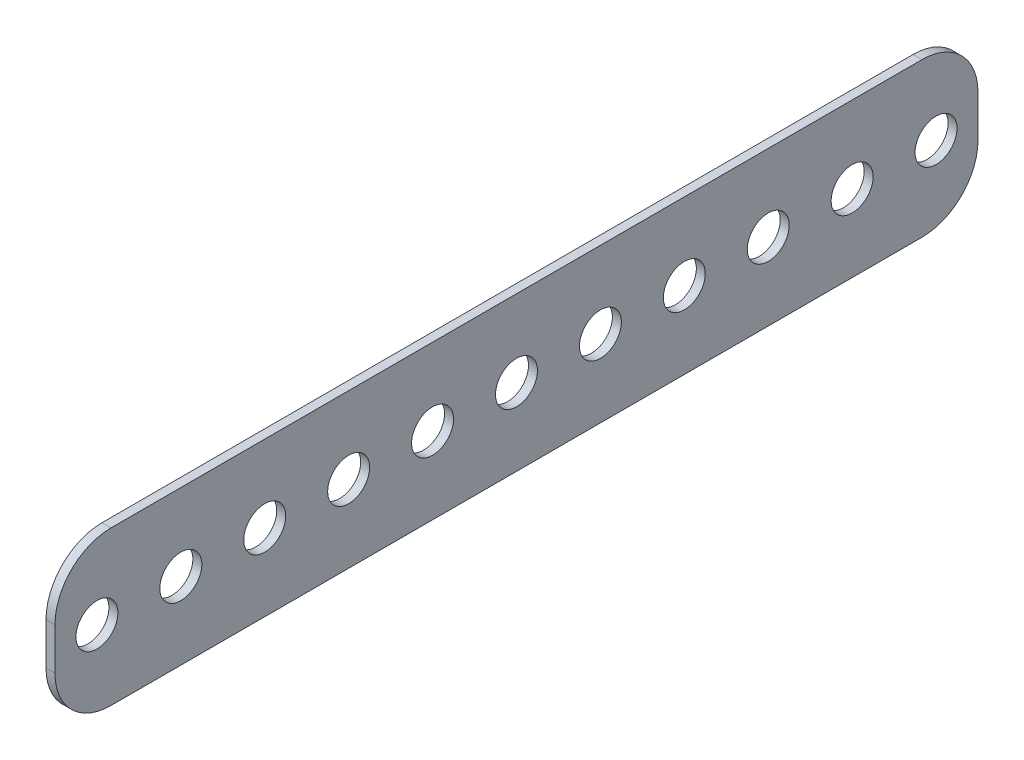
ISO-10303-21;
HEADER;
FILE_DESCRIPTION(('STEP AP214'),'2;1');
FILE_NAME('part.step','',(''),(''),'','','');
FILE_SCHEMA(('AUTOMOTIVE_DESIGN { 1 0 10303 214 1 1 1 1 }'));
ENDSEC;
DATA;
#1=APPLICATION_CONTEXT('core data for automotive mechanical design processes');
#2=APPLICATION_PROTOCOL_DEFINITION('international standard','automotive_design',2000,#1);
#3=PRODUCT_CONTEXT('',#1,'mechanical');
#4=PRODUCT('Part','Part','',(#3));
#5=PRODUCT_RELATED_PRODUCT_CATEGORY('part','',(#4));
#6=PRODUCT_DEFINITION_FORMATION('','',#4);
#7=PRODUCT_DEFINITION_CONTEXT('part definition',#1,'design');
#8=PRODUCT_DEFINITION('design','',#6,#7);
#9=PRODUCT_DEFINITION_SHAPE('','',#8);
#10=(LENGTH_UNIT() NAMED_UNIT(*) SI_UNIT(.MILLI.,.METRE.));
#11=(NAMED_UNIT(*) PLANE_ANGLE_UNIT() SI_UNIT($,.RADIAN.));
#12=(NAMED_UNIT(*) SI_UNIT($,.STERADIAN.) SOLID_ANGLE_UNIT());
#13=UNCERTAINTY_MEASURE_WITH_UNIT(LENGTH_MEASURE(1.E-05),#10,'distance_accuracy_value','');
#14=(GEOMETRIC_REPRESENTATION_CONTEXT(3) GLOBAL_UNCERTAINTY_ASSIGNED_CONTEXT((#13)) GLOBAL_UNIT_ASSIGNED_CONTEXT((#10,
#11,#12)) REPRESENTATION_CONTEXT('',''));
#15=CARTESIAN_POINT('',(0.,0.,0.));
#16=DIRECTION('',(0.,0.,1.));
#17=DIRECTION('',(1.,0.,0.));
#18=AXIS2_PLACEMENT_3D('',#15,#16,#17);
#19=CARTESIAN_POINT('',(0.,0.,152.4));
#20=DIRECTION('',(1.,0.,0.));
#21=DIRECTION('',(0.,0.,-1.));
#22=AXIS2_PLACEMENT_3D('',#19,#20,#21);
#23=PLANE('',#22);
#24=CARTESIAN_POINT('',(0.,17.4625,123.825));
#25=DIRECTION('',(-1.,0.,0.));
#26=DIRECTION('',(0.,0.,1.));
#27=AXIS2_PLACEMENT_3D('',#24,#25,#26);
#28=CIRCLE('',#27,4.76250000000001);
#29=CARTESIAN_POINT('',(0.,17.4625,128.5875));
#30=VERTEX_POINT('',#29);
#31=EDGE_CURVE('E290',#30,#30,#28,.T.);
#32=ORIENTED_EDGE('',*,*,#31,.F.);
#33=EDGE_LOOP('',(#32));
#34=FACE_BOUND('',#33,.T.);
#35=CARTESIAN_POINT('',(0.,17.4625,142.875));
#36=DIRECTION('',(-1.,0.,0.));
#37=DIRECTION('',(0.,0.,1.));
#38=AXIS2_PLACEMENT_3D('',#35,#36,#37);
#39=CIRCLE('',#38,4.76250000000001);
#40=CARTESIAN_POINT('',(0.,17.4625,147.6375));
#41=VERTEX_POINT('',#40);
#42=EDGE_CURVE('E186',#41,#41,#39,.T.);
#43=ORIENTED_EDGE('',*,*,#42,.F.);
#44=EDGE_LOOP('',(#43));
#45=FACE_BOUND('',#44,.T.);
#46=DIRECTION('',(0.,-1.,0.));
#47=VECTOR('',#46,1.);
#48=CARTESIAN_POINT('',(0.,34.925,-57.15));
#49=LINE('',#48,#47);
#50=CARTESIAN_POINT('',(0.,22.225,-57.15));
#51=VERTEX_POINT('',#50);
#52=CARTESIAN_POINT('',(0.,12.7,-57.15));
#53=VERTEX_POINT('',#52);
#54=EDGE_CURVE('E284',#51,#53,#49,.T.);
#55=ORIENTED_EDGE('',*,*,#54,.T.);
#56=CARTESIAN_POINT('',(0.,12.7,-44.45));
#57=DIRECTION('',(1.,0.,0.));
#58=DIRECTION('',(0.,0.,-1.));
#59=AXIS2_PLACEMENT_3D('',#56,#57,#58);
#60=CIRCLE('',#59,12.7);
#61=CARTESIAN_POINT('',(0.,0.,-44.4499999999999));
#62=VERTEX_POINT('',#61);
#63=EDGE_CURVE('E141',#53,#62,#60,.F.);
#64=ORIENTED_EDGE('',*,*,#63,.T.);
#65=DIRECTION('',(0.,0.,-1.));
#66=VECTOR('',#65,1.);
#67=CARTESIAN_POINT('',(0.,0.,152.4));
#68=LINE('',#67,#66);
#69=CARTESIAN_POINT('',(0.,0.,139.7));
#70=VERTEX_POINT('',#69);
#71=EDGE_CURVE('E129',#70,#62,#68,.T.);
#72=ORIENTED_EDGE('',*,*,#71,.F.);
#73=CARTESIAN_POINT('',(0.,12.7,139.7));
#74=DIRECTION('',(1.,0.,0.));
#75=DIRECTION('',(0.,0.,-1.));
#76=AXIS2_PLACEMENT_3D('',#73,#74,#75);
#77=CIRCLE('',#76,12.7);
#78=CARTESIAN_POINT('',(0.,12.7,152.4));
#79=VERTEX_POINT('',#78);
#80=EDGE_CURVE('E59',#70,#79,#77,.F.);
#81=ORIENTED_EDGE('',*,*,#80,.T.);
#82=DIRECTION('',(0.,-1.,0.));
#83=VECTOR('',#82,1.);
#84=CARTESIAN_POINT('',(0.,0.,152.4));
#85=LINE('',#84,#83);
#86=CARTESIAN_POINT('',(0.,22.225,152.4));
#87=VERTEX_POINT('',#86);
#88=EDGE_CURVE('E173',#87,#79,#85,.T.);
#89=ORIENTED_EDGE('',*,*,#88,.F.);
#90=CARTESIAN_POINT('',(0.,22.225,139.7));
#91=DIRECTION('',(1.,0.,0.));
#92=DIRECTION('',(0.,0.,-1.));
#93=AXIS2_PLACEMENT_3D('',#90,#91,#92);
#94=CIRCLE('',#93,12.7);
#95=CARTESIAN_POINT('',(0.,34.925,139.7));
#96=VERTEX_POINT('',#95);
#97=EDGE_CURVE('E70',#87,#96,#94,.F.);
#98=ORIENTED_EDGE('',*,*,#97,.T.);
#99=DIRECTION('',(0.,0.,-1.));
#100=VECTOR('',#99,1.);
#101=CARTESIAN_POINT('',(0.,34.925,152.4));
#102=LINE('',#101,#100);
#103=CARTESIAN_POINT('',(0.,34.925,-44.4499999999999));
#104=VERTEX_POINT('',#103);
#105=EDGE_CURVE('E182',#96,#104,#102,.T.);
#106=ORIENTED_EDGE('',*,*,#105,.T.);
#107=CARTESIAN_POINT('',(0.,22.225,-44.45));
#108=DIRECTION('',(1.,0.,0.));
#109=DIRECTION('',(0.,0.,-1.));
#110=AXIS2_PLACEMENT_3D('',#107,#108,#109);
#111=CIRCLE('',#110,12.7);
#112=EDGE_CURVE('E148',#104,#51,#111,.F.);
#113=ORIENTED_EDGE('',*,*,#112,.T.);
#114=EDGE_LOOP('',(#55,#64,#72,#81,#89,#98,#106,#113));
#115=FACE_BOUND('',#114,.T.);
#116=CARTESIAN_POINT('',(0.,17.4625,104.775));
#117=DIRECTION('',(-1.,0.,0.));
#118=DIRECTION('',(0.,0.,1.));
#119=AXIS2_PLACEMENT_3D('',#116,#117,#118);
#120=CIRCLE('',#119,4.76250000000001);
#121=CARTESIAN_POINT('',(0.,17.4625,109.5375));
#122=VERTEX_POINT('',#121);
#123=EDGE_CURVE('E143',#122,#122,#120,.T.);
#124=ORIENTED_EDGE('',*,*,#123,.F.);
#125=EDGE_LOOP('',(#124));
#126=FACE_BOUND('',#125,.T.);
#127=CARTESIAN_POINT('',(0.,17.4625,85.725));
#128=DIRECTION('',(-1.,0.,0.));
#129=DIRECTION('',(0.,0.,1.));
#130=AXIS2_PLACEMENT_3D('',#127,#128,#129);
#131=CIRCLE('',#130,4.76250000000001);
#132=CARTESIAN_POINT('',(0.,17.4625,90.4875));
#133=VERTEX_POINT('',#132);
#134=EDGE_CURVE('E205',#133,#133,#131,.T.);
#135=ORIENTED_EDGE('',*,*,#134,.F.);
#136=EDGE_LOOP('',(#135));
#137=FACE_BOUND('',#136,.T.);
#138=CARTESIAN_POINT('',(0.,17.4625,66.675));
#139=DIRECTION('',(-1.,0.,0.));
#140=DIRECTION('',(0.,0.,1.));
#141=AXIS2_PLACEMENT_3D('',#138,#139,#140);
#142=CIRCLE('',#141,4.76250000000001);
#143=CARTESIAN_POINT('',(0.,17.4625,71.4375));
#144=VERTEX_POINT('',#143);
#145=EDGE_CURVE('E213',#144,#144,#142,.T.);
#146=ORIENTED_EDGE('',*,*,#145,.F.);
#147=EDGE_LOOP('',(#146));
#148=FACE_BOUND('',#147,.T.);
#149=CARTESIAN_POINT('',(0.,17.4625,47.625));
#150=DIRECTION('',(-1.,0.,0.));
#151=DIRECTION('',(0.,0.,1.));
#152=AXIS2_PLACEMENT_3D('',#149,#150,#151);
#153=CIRCLE('',#152,4.76250000000001);
#154=CARTESIAN_POINT('',(0.,17.4625,52.3875));
#155=VERTEX_POINT('',#154);
#156=EDGE_CURVE('E221',#155,#155,#153,.T.);
#157=ORIENTED_EDGE('',*,*,#156,.F.);
#158=EDGE_LOOP('',(#157));
#159=FACE_BOUND('',#158,.T.);
#160=CARTESIAN_POINT('',(0.,17.4625,28.575));
#161=DIRECTION('',(-1.,0.,0.));
#162=DIRECTION('',(0.,0.,1.));
#163=AXIS2_PLACEMENT_3D('',#160,#161,#162);
#164=CIRCLE('',#163,4.76250000000001);
#165=CARTESIAN_POINT('',(0.,17.4625,33.3375));
#166=VERTEX_POINT('',#165);
#167=EDGE_CURVE('E229',#166,#166,#164,.T.);
#168=ORIENTED_EDGE('',*,*,#167,.F.);
#169=EDGE_LOOP('',(#168));
#170=FACE_BOUND('',#169,.T.);
#171=CARTESIAN_POINT('',(0.,17.4625,9.52500000000001));
#172=DIRECTION('',(-1.,0.,0.));
#173=DIRECTION('',(0.,0.,1.));
#174=AXIS2_PLACEMENT_3D('',#171,#172,#173);
#175=CIRCLE('',#174,4.76250000000001);
#176=CARTESIAN_POINT('',(0.,17.4625,14.2875));
#177=VERTEX_POINT('',#176);
#178=EDGE_CURVE('E235',#177,#177,#175,.T.);
#179=ORIENTED_EDGE('',*,*,#178,.F.);
#180=EDGE_LOOP('',(#179));
#181=FACE_BOUND('',#180,.T.);
#182=CARTESIAN_POINT('',(0.,17.4625,-9.52499999999999));
#183=DIRECTION('',(-1.,0.,0.));
#184=DIRECTION('',(0.,0.,1.));
#185=AXIS2_PLACEMENT_3D('',#182,#183,#184);
#186=CIRCLE('',#185,4.76250000000001);
#187=CARTESIAN_POINT('',(0.,17.4625,-4.76249999999998));
#188=VERTEX_POINT('',#187);
#189=EDGE_CURVE('E242',#188,#188,#186,.T.);
#190=ORIENTED_EDGE('',*,*,#189,.F.);
#191=EDGE_LOOP('',(#190));
#192=FACE_BOUND('',#191,.T.);
#193=CARTESIAN_POINT('',(0.,17.4625,-28.575));
#194=DIRECTION('',(-1.,0.,0.));
#195=DIRECTION('',(0.,0.,1.));
#196=AXIS2_PLACEMENT_3D('',#193,#194,#195);
#197=CIRCLE('',#196,4.76250000000001);
#198=CARTESIAN_POINT('',(0.,17.4625,-23.8125));
#199=VERTEX_POINT('',#198);
#200=EDGE_CURVE('E250',#199,#199,#197,.T.);
#201=ORIENTED_EDGE('',*,*,#200,.F.);
#202=EDGE_LOOP('',(#201));
#203=FACE_BOUND('',#202,.T.);
#204=CARTESIAN_POINT('',(0.,17.4625,-47.625));
#205=DIRECTION('',(-1.,0.,0.));
#206=DIRECTION('',(0.,0.,1.));
#207=AXIS2_PLACEMENT_3D('',#204,#205,#206);
#208=CIRCLE('',#207,4.76250000000001);
#209=CARTESIAN_POINT('',(0.,17.4625,-42.8625));
#210=VERTEX_POINT('',#209);
#211=EDGE_CURVE('E256',#210,#210,#208,.T.);
#212=ORIENTED_EDGE('',*,*,#211,.F.);
#213=EDGE_LOOP('',(#212));
#214=FACE_BOUND('',#213,.T.);
#215=ADVANCED_FACE('F40',(#34,#45,#115,#126,#137,#148,#159,#170,#181,#192,#203,#214),#23,.F.);
#216=CARTESIAN_POINT('',(2.032,0.,152.4));
#217=DIRECTION('',(0.,1.,0.));
#218=DIRECTION('',(-1.,0.,0.));
#219=AXIS2_PLACEMENT_3D('',#216,#217,#218);
#220=PLANE('',#219);
#221=ORIENTED_EDGE('',*,*,#71,.T.);
#222=DIRECTION('',(1.,0.,0.));
#223=VECTOR('',#222,1.);
#224=CARTESIAN_POINT('',(2.032,0.,-44.45));
#225=LINE('',#224,#223);
#226=CARTESIAN_POINT('',(2.032,0.,-44.4499999999999));
#227=VERTEX_POINT('',#226);
#228=EDGE_CURVE('E135',#62,#227,#225,.T.);
#229=ORIENTED_EDGE('',*,*,#228,.T.);
#230=DIRECTION('',(0.,0.,-1.));
#231=VECTOR('',#230,1.);
#232=CARTESIAN_POINT('',(2.032,0.,152.4));
#233=LINE('',#232,#231);
#234=CARTESIAN_POINT('',(2.032,0.,139.7));
#235=VERTEX_POINT('',#234);
#236=EDGE_CURVE('E132',#235,#227,#233,.T.);
#237=ORIENTED_EDGE('',*,*,#236,.F.);
#238=DIRECTION('',(1.,0.,0.));
#239=VECTOR('',#238,1.);
#240=CARTESIAN_POINT('',(0.,0.,139.7));
#241=LINE('',#240,#239);
#242=EDGE_CURVE('E126',#235,#70,#241,.F.);
#243=ORIENTED_EDGE('',*,*,#242,.T.);
#244=EDGE_LOOP('',(#221,#229,#237,#243));
#245=FACE_BOUND('',#244,.T.);
#246=ADVANCED_FACE('F127',(#245),#220,.F.);
#247=CARTESIAN_POINT('',(2.032,0.,152.4));
#248=DIRECTION('',(-1.,0.,0.));
#249=DIRECTION('',(0.,0.,1.));
#250=AXIS2_PLACEMENT_3D('',#247,#248,#249);
#251=PLANE('',#250);
#252=CARTESIAN_POINT('',(2.032,17.4625,123.825));
#253=DIRECTION('',(-1.,0.,0.));
#254=DIRECTION('',(0.,0.,1.));
#255=AXIS2_PLACEMENT_3D('',#252,#253,#254);
#256=CIRCLE('',#255,4.76250000000001);
#257=CARTESIAN_POINT('',(2.032,17.4625,128.5875));
#258=VERTEX_POINT('',#257);
#259=EDGE_CURVE('E308',#258,#258,#256,.F.);
#260=ORIENTED_EDGE('',*,*,#259,.F.);
#261=EDGE_LOOP('',(#260));
#262=FACE_BOUND('',#261,.T.);
#263=CARTESIAN_POINT('',(2.032,17.4625,142.875));
#264=DIRECTION('',(-1.,0.,0.));
#265=DIRECTION('',(0.,0.,1.));
#266=AXIS2_PLACEMENT_3D('',#263,#264,#265);
#267=CIRCLE('',#266,4.76250000000001);
#268=CARTESIAN_POINT('',(2.032,17.4625,147.6375));
#269=VERTEX_POINT('',#268);
#270=EDGE_CURVE('E179',#269,#269,#267,.F.);
#271=ORIENTED_EDGE('',*,*,#270,.F.);
#272=EDGE_LOOP('',(#271));
#273=FACE_BOUND('',#272,.T.);
#274=ORIENTED_EDGE('',*,*,#236,.T.);
#275=CARTESIAN_POINT('',(2.032,12.7,-44.45));
#276=DIRECTION('',(-1.,0.,0.));
#277=DIRECTION('',(0.,0.,1.));
#278=AXIS2_PLACEMENT_3D('',#275,#276,#277);
#279=CIRCLE('',#278,12.7);
#280=CARTESIAN_POINT('',(2.032,12.7,-57.15));
#281=VERTEX_POINT('',#280);
#282=EDGE_CURVE('E273',#227,#281,#279,.F.);
#283=ORIENTED_EDGE('',*,*,#282,.T.);
#284=DIRECTION('',(0.,1.,0.));
#285=VECTOR('',#284,1.);
#286=CARTESIAN_POINT('',(2.032,0.,-57.15));
#287=LINE('',#286,#285);
#288=CARTESIAN_POINT('',(2.032,22.225,-57.15));
#289=VERTEX_POINT('',#288);
#290=EDGE_CURVE('E287',#281,#289,#287,.T.);
#291=ORIENTED_EDGE('',*,*,#290,.T.);
#292=CARTESIAN_POINT('',(2.032,22.225,-44.45));
#293=DIRECTION('',(-1.,0.,0.));
#294=DIRECTION('',(0.,0.,1.));
#295=AXIS2_PLACEMENT_3D('',#292,#293,#294);
#296=CIRCLE('',#295,12.7);
#297=CARTESIAN_POINT('',(2.032,34.925,-44.4499999999999));
#298=VERTEX_POINT('',#297);
#299=EDGE_CURVE('E271',#289,#298,#296,.F.);
#300=ORIENTED_EDGE('',*,*,#299,.T.);
#301=DIRECTION('',(0.,0.,-1.));
#302=VECTOR('',#301,1.);
#303=CARTESIAN_POINT('',(2.032,34.925,152.4));
#304=LINE('',#303,#302);
#305=CARTESIAN_POINT('',(2.032,34.925,139.7));
#306=VERTEX_POINT('',#305);
#307=EDGE_CURVE('E192',#306,#298,#304,.T.);
#308=ORIENTED_EDGE('',*,*,#307,.F.);
#309=CARTESIAN_POINT('',(2.032,22.225,139.7));
#310=DIRECTION('',(-1.,0.,0.));
#311=DIRECTION('',(0.,0.,1.));
#312=AXIS2_PLACEMENT_3D('',#309,#310,#311);
#313=CIRCLE('',#312,12.7);
#314=CARTESIAN_POINT('',(2.032,22.225,152.4));
#315=VERTEX_POINT('',#314);
#316=EDGE_CURVE('E265',#306,#315,#313,.F.);
#317=ORIENTED_EDGE('',*,*,#316,.T.);
#318=DIRECTION('',(0.,1.,0.));
#319=VECTOR('',#318,1.);
#320=CARTESIAN_POINT('',(2.032,0.,152.4));
#321=LINE('',#320,#319);
#322=CARTESIAN_POINT('',(2.032,12.7,152.4));
#323=VERTEX_POINT('',#322);
#324=EDGE_CURVE('E175',#323,#315,#321,.T.);
#325=ORIENTED_EDGE('',*,*,#324,.F.);
#326=CARTESIAN_POINT('',(2.032,12.7,139.7));
#327=DIRECTION('',(-1.,0.,0.));
#328=DIRECTION('',(0.,0.,1.));
#329=AXIS2_PLACEMENT_3D('',#326,#327,#328);
#330=CIRCLE('',#329,12.7);
#331=EDGE_CURVE('E268',#323,#235,#330,.F.);
#332=ORIENTED_EDGE('',*,*,#331,.T.);
#333=EDGE_LOOP('',(#274,#283,#291,#300,#308,#317,#325,#332));
#334=FACE_BOUND('',#333,.T.);
#335=CARTESIAN_POINT('',(2.032,17.4625,104.775));
#336=DIRECTION('',(-1.,0.,0.));
#337=DIRECTION('',(0.,0.,1.));
#338=AXIS2_PLACEMENT_3D('',#335,#336,#337);
#339=CIRCLE('',#338,4.76250000000001);
#340=CARTESIAN_POINT('',(2.032,17.4625,109.5375));
#341=VERTEX_POINT('',#340);
#342=EDGE_CURVE('E201',#341,#341,#339,.F.);
#343=ORIENTED_EDGE('',*,*,#342,.F.);
#344=EDGE_LOOP('',(#343));
#345=FACE_BOUND('',#344,.T.);
#346=CARTESIAN_POINT('',(2.032,17.4625,85.725));
#347=DIRECTION('',(-1.,0.,0.));
#348=DIRECTION('',(0.,0.,1.));
#349=AXIS2_PLACEMENT_3D('',#346,#347,#348);
#350=CIRCLE('',#349,4.76250000000001);
#351=CARTESIAN_POINT('',(2.032,17.4625,90.4875));
#352=VERTEX_POINT('',#351);
#353=EDGE_CURVE('E209',#352,#352,#350,.F.);
#354=ORIENTED_EDGE('',*,*,#353,.F.);
#355=EDGE_LOOP('',(#354));
#356=FACE_BOUND('',#355,.T.);
#357=CARTESIAN_POINT('',(2.032,17.4625,66.675));
#358=DIRECTION('',(-1.,0.,0.));
#359=DIRECTION('',(0.,0.,1.));
#360=AXIS2_PLACEMENT_3D('',#357,#358,#359);
#361=CIRCLE('',#360,4.76250000000001);
#362=CARTESIAN_POINT('',(2.032,17.4625,71.4375));
#363=VERTEX_POINT('',#362);
#364=EDGE_CURVE('E217',#363,#363,#361,.F.);
#365=ORIENTED_EDGE('',*,*,#364,.F.);
#366=EDGE_LOOP('',(#365));
#367=FACE_BOUND('',#366,.T.);
#368=CARTESIAN_POINT('',(2.032,17.4625,47.625));
#369=DIRECTION('',(-1.,0.,0.));
#370=DIRECTION('',(0.,0.,1.));
#371=AXIS2_PLACEMENT_3D('',#368,#369,#370);
#372=CIRCLE('',#371,4.76250000000001);
#373=CARTESIAN_POINT('',(2.032,17.4625,52.3875));
#374=VERTEX_POINT('',#373);
#375=EDGE_CURVE('E225',#374,#374,#372,.F.);
#376=ORIENTED_EDGE('',*,*,#375,.F.);
#377=EDGE_LOOP('',(#376));
#378=FACE_BOUND('',#377,.T.);
#379=CARTESIAN_POINT('',(2.032,17.4625,28.575));
#380=DIRECTION('',(-1.,0.,0.));
#381=DIRECTION('',(0.,0.,1.));
#382=AXIS2_PLACEMENT_3D('',#379,#380,#381);
#383=CIRCLE('',#382,4.76250000000001);
#384=CARTESIAN_POINT('',(2.032,17.4625,33.3375));
#385=VERTEX_POINT('',#384);
#386=EDGE_CURVE('E232',#385,#385,#383,.F.);
#387=ORIENTED_EDGE('',*,*,#386,.F.);
#388=EDGE_LOOP('',(#387));
#389=FACE_BOUND('',#388,.T.);
#390=CARTESIAN_POINT('',(2.032,17.4625,9.52500000000001));
#391=DIRECTION('',(-1.,0.,0.));
#392=DIRECTION('',(0.,0.,1.));
#393=AXIS2_PLACEMENT_3D('',#390,#391,#392);
#394=CIRCLE('',#393,4.76250000000001);
#395=CARTESIAN_POINT('',(2.032,17.4625,14.2875));
#396=VERTEX_POINT('',#395);
#397=EDGE_CURVE('E238',#396,#396,#394,.F.);
#398=ORIENTED_EDGE('',*,*,#397,.F.);
#399=EDGE_LOOP('',(#398));
#400=FACE_BOUND('',#399,.T.);
#401=CARTESIAN_POINT('',(2.032,17.4625,-9.52499999999999));
#402=DIRECTION('',(-1.,0.,0.));
#403=DIRECTION('',(0.,0.,1.));
#404=AXIS2_PLACEMENT_3D('',#401,#402,#403);
#405=CIRCLE('',#404,4.76250000000001);
#406=CARTESIAN_POINT('',(2.032,17.4625,-4.76249999999998));
#407=VERTEX_POINT('',#406);
#408=EDGE_CURVE('E246',#407,#407,#405,.F.);
#409=ORIENTED_EDGE('',*,*,#408,.F.);
#410=EDGE_LOOP('',(#409));
#411=FACE_BOUND('',#410,.T.);
#412=CARTESIAN_POINT('',(2.032,17.4625,-28.575));
#413=DIRECTION('',(-1.,0.,0.));
#414=DIRECTION('',(0.,0.,1.));
#415=AXIS2_PLACEMENT_3D('',#412,#413,#414);
#416=CIRCLE('',#415,4.76250000000001);
#417=CARTESIAN_POINT('',(2.032,17.4625,-23.8125));
#418=VERTEX_POINT('',#417);
#419=EDGE_CURVE('E253',#418,#418,#416,.F.);
#420=ORIENTED_EDGE('',*,*,#419,.F.);
#421=EDGE_LOOP('',(#420));
#422=FACE_BOUND('',#421,.T.);
#423=CARTESIAN_POINT('',(2.032,17.4625,-47.625));
#424=DIRECTION('',(-1.,0.,0.));
#425=DIRECTION('',(0.,0.,1.));
#426=AXIS2_PLACEMENT_3D('',#423,#424,#425);
#427=CIRCLE('',#426,4.76250000000001);
#428=CARTESIAN_POINT('',(2.032,17.4625,-42.8625));
#429=VERTEX_POINT('',#428);
#430=EDGE_CURVE('E136',#429,#429,#427,.F.);
#431=ORIENTED_EDGE('',*,*,#430,.F.);
#432=EDGE_LOOP('',(#431));
#433=FACE_BOUND('',#432,.T.);
#434=ADVANCED_FACE('F294',(#262,#273,#334,#345,#356,#367,#378,#389,#400,#411,#422,#433),#251,.F.);
#435=CARTESIAN_POINT('',(2.032,34.925,152.4));
#436=DIRECTION('',(0.,-1.,0.));
#437=DIRECTION('',(0.,0.,-1.));
#438=AXIS2_PLACEMENT_3D('',#435,#436,#437);
#439=PLANE('',#438);
#440=ORIENTED_EDGE('',*,*,#307,.T.);
#441=DIRECTION('',(-1.,0.,0.));
#442=VECTOR('',#441,1.);
#443=CARTESIAN_POINT('',(2.032,34.925,-44.45));
#444=LINE('',#443,#442);
#445=EDGE_CURVE('E164',#298,#104,#444,.T.);
#446=ORIENTED_EDGE('',*,*,#445,.T.);
#447=ORIENTED_EDGE('',*,*,#105,.F.);
#448=DIRECTION('',(-1.,0.,0.));
#449=VECTOR('',#448,1.);
#450=CARTESIAN_POINT('',(2.032,34.925,139.7));
#451=LINE('',#450,#449);
#452=EDGE_CURVE('E161',#96,#306,#451,.F.);
#453=ORIENTED_EDGE('',*,*,#452,.T.);
#454=EDGE_LOOP('',(#440,#446,#447,#453));
#455=FACE_BOUND('',#454,.T.);
#456=ADVANCED_FACE('F298',(#455),#439,.F.);
#457=CARTESIAN_POINT('',(0.,34.925,152.4));
#458=DIRECTION('',(0.,0.,1.));
#459=DIRECTION('',(1.,0.,0.));
#460=AXIS2_PLACEMENT_3D('',#457,#458,#459);
#461=PLANE('',#460);
#462=ORIENTED_EDGE('',*,*,#88,.T.);
#463=DIRECTION('',(1.,0.,0.));
#464=VECTOR('',#463,1.);
#465=CARTESIAN_POINT('',(2.032,12.7,152.4));
#466=LINE('',#465,#464);
#467=EDGE_CURVE('E11',#79,#323,#466,.T.);
#468=ORIENTED_EDGE('',*,*,#467,.T.);
#469=ORIENTED_EDGE('',*,*,#324,.T.);
#470=DIRECTION('',(-1.,0.,0.));
#471=VECTOR('',#470,1.);
#472=CARTESIAN_POINT('',(0.,22.225,152.4));
#473=LINE('',#472,#471);
#474=EDGE_CURVE('E49',#315,#87,#473,.T.);
#475=ORIENTED_EDGE('',*,*,#474,.T.);
#476=EDGE_LOOP('',(#462,#468,#469,#475));
#477=FACE_BOUND('',#476,.T.);
#478=ADVANCED_FACE('F172',(#477),#461,.T.);
#479=CARTESIAN_POINT('',(2.033,17.4625,142.875));
#480=DIRECTION('',(-1.,0.,0.));
#481=DIRECTION('',(0.,0.,1.));
#482=AXIS2_PLACEMENT_3D('',#479,#480,#481);
#483=CYLINDRICAL_SURFACE('',#482,4.76250000000001);
#484=ORIENTED_EDGE('',*,*,#42,.T.);
#485=EDGE_LOOP('',(#484));
#486=FACE_BOUND('',#485,.T.);
#487=ORIENTED_EDGE('',*,*,#270,.T.);
#488=EDGE_LOOP('',(#487));
#489=FACE_BOUND('',#488,.T.);
#490=ADVANCED_FACE('F315',(#486,#489),#483,.F.);
#491=CARTESIAN_POINT('',(2.033,17.4625,123.825));
#492=DIRECTION('',(-1.,0.,0.));
#493=DIRECTION('',(0.,0.,1.));
#494=AXIS2_PLACEMENT_3D('',#491,#492,#493);
#495=CYLINDRICAL_SURFACE('',#494,4.76250000000001);
#496=ORIENTED_EDGE('',*,*,#31,.T.);
#497=EDGE_LOOP('',(#496));
#498=FACE_BOUND('',#497,.T.);
#499=ORIENTED_EDGE('',*,*,#259,.T.);
#500=EDGE_LOOP('',(#499));
#501=FACE_BOUND('',#500,.T.);
#502=ADVANCED_FACE('F332',(#498,#501),#495,.F.);
#503=CARTESIAN_POINT('',(2.033,17.4625,104.775));
#504=DIRECTION('',(-1.,0.,0.));
#505=DIRECTION('',(0.,0.,1.));
#506=AXIS2_PLACEMENT_3D('',#503,#504,#505);
#507=CYLINDRICAL_SURFACE('',#506,4.76250000000001);
#508=ORIENTED_EDGE('',*,*,#123,.T.);
#509=EDGE_LOOP('',(#508));
#510=FACE_BOUND('',#509,.T.);
#511=ORIENTED_EDGE('',*,*,#342,.T.);
#512=EDGE_LOOP('',(#511));
#513=FACE_BOUND('',#512,.T.);
#514=ADVANCED_FACE('F328',(#510,#513),#507,.F.);
#515=CARTESIAN_POINT('',(2.033,17.4625,85.725));
#516=DIRECTION('',(-1.,0.,0.));
#517=DIRECTION('',(0.,0.,1.));
#518=AXIS2_PLACEMENT_3D('',#515,#516,#517);
#519=CYLINDRICAL_SURFACE('',#518,4.76250000000001);
#520=ORIENTED_EDGE('',*,*,#134,.T.);
#521=EDGE_LOOP('',(#520));
#522=FACE_BOUND('',#521,.T.);
#523=ORIENTED_EDGE('',*,*,#353,.T.);
#524=EDGE_LOOP('',(#523));
#525=FACE_BOUND('',#524,.T.);
#526=ADVANCED_FACE('F331',(#522,#525),#519,.F.);
#527=CARTESIAN_POINT('',(2.033,17.4625,66.675));
#528=DIRECTION('',(-1.,0.,0.));
#529=DIRECTION('',(0.,0.,1.));
#530=AXIS2_PLACEMENT_3D('',#527,#528,#529);
#531=CYLINDRICAL_SURFACE('',#530,4.76250000000001);
#532=ORIENTED_EDGE('',*,*,#145,.T.);
#533=EDGE_LOOP('',(#532));
#534=FACE_BOUND('',#533,.T.);
#535=ORIENTED_EDGE('',*,*,#364,.T.);
#536=EDGE_LOOP('',(#535));
#537=FACE_BOUND('',#536,.T.);
#538=ADVANCED_FACE('F336',(#534,#537),#531,.F.);
#539=CARTESIAN_POINT('',(2.033,17.4625,47.625));
#540=DIRECTION('',(-1.,0.,0.));
#541=DIRECTION('',(0.,0.,1.));
#542=AXIS2_PLACEMENT_3D('',#539,#540,#541);
#543=CYLINDRICAL_SURFACE('',#542,4.76250000000001);
#544=ORIENTED_EDGE('',*,*,#156,.T.);
#545=EDGE_LOOP('',(#544));
#546=FACE_BOUND('',#545,.T.);
#547=ORIENTED_EDGE('',*,*,#375,.T.);
#548=EDGE_LOOP('',(#547));
#549=FACE_BOUND('',#548,.T.);
#550=ADVANCED_FACE('F340',(#546,#549),#543,.F.);
#551=CARTESIAN_POINT('',(2.033,17.4625,28.575));
#552=DIRECTION('',(-1.,0.,0.));
#553=DIRECTION('',(0.,0.,1.));
#554=AXIS2_PLACEMENT_3D('',#551,#552,#553);
#555=CYLINDRICAL_SURFACE('',#554,4.76250000000001);
#556=ORIENTED_EDGE('',*,*,#167,.T.);
#557=EDGE_LOOP('',(#556));
#558=FACE_BOUND('',#557,.T.);
#559=ORIENTED_EDGE('',*,*,#386,.T.);
#560=EDGE_LOOP('',(#559));
#561=FACE_BOUND('',#560,.T.);
#562=ADVANCED_FACE('F344',(#558,#561),#555,.F.);
#563=CARTESIAN_POINT('',(2.033,17.4625,9.52500000000001));
#564=DIRECTION('',(-1.,0.,0.));
#565=DIRECTION('',(0.,0.,1.));
#566=AXIS2_PLACEMENT_3D('',#563,#564,#565);
#567=CYLINDRICAL_SURFACE('',#566,4.76250000000001);
#568=ORIENTED_EDGE('',*,*,#178,.T.);
#569=EDGE_LOOP('',(#568));
#570=FACE_BOUND('',#569,.T.);
#571=ORIENTED_EDGE('',*,*,#397,.T.);
#572=EDGE_LOOP('',(#571));
#573=FACE_BOUND('',#572,.T.);
#574=ADVANCED_FACE('F348',(#570,#573),#567,.F.);
#575=CARTESIAN_POINT('',(2.033,17.4625,-9.52499999999999));
#576=DIRECTION('',(-1.,0.,0.));
#577=DIRECTION('',(0.,0.,1.));
#578=AXIS2_PLACEMENT_3D('',#575,#576,#577);
#579=CYLINDRICAL_SURFACE('',#578,4.76250000000001);
#580=ORIENTED_EDGE('',*,*,#189,.T.);
#581=EDGE_LOOP('',(#580));
#582=FACE_BOUND('',#581,.T.);
#583=ORIENTED_EDGE('',*,*,#408,.T.);
#584=EDGE_LOOP('',(#583));
#585=FACE_BOUND('',#584,.T.);
#586=ADVANCED_FACE('F352',(#582,#585),#579,.F.);
#587=CARTESIAN_POINT('',(2.033,17.4625,-28.575));
#588=DIRECTION('',(-1.,0.,0.));
#589=DIRECTION('',(0.,0.,1.));
#590=AXIS2_PLACEMENT_3D('',#587,#588,#589);
#591=CYLINDRICAL_SURFACE('',#590,4.76250000000001);
#592=ORIENTED_EDGE('',*,*,#200,.T.);
#593=EDGE_LOOP('',(#592));
#594=FACE_BOUND('',#593,.T.);
#595=ORIENTED_EDGE('',*,*,#419,.T.);
#596=EDGE_LOOP('',(#595));
#597=FACE_BOUND('',#596,.T.);
#598=ADVANCED_FACE('F356',(#594,#597),#591,.F.);
#599=CARTESIAN_POINT('',(2.033,17.4625,-47.625));
#600=DIRECTION('',(-1.,0.,0.));
#601=DIRECTION('',(0.,0.,1.));
#602=AXIS2_PLACEMENT_3D('',#599,#600,#601);
#603=CYLINDRICAL_SURFACE('',#602,4.76250000000001);
#604=ORIENTED_EDGE('',*,*,#211,.T.);
#605=EDGE_LOOP('',(#604));
#606=FACE_BOUND('',#605,.T.);
#607=ORIENTED_EDGE('',*,*,#430,.T.);
#608=EDGE_LOOP('',(#607));
#609=FACE_BOUND('',#608,.T.);
#610=ADVANCED_FACE('F360',(#606,#609),#603,.F.);
#611=CARTESIAN_POINT('',(0.,0.,-57.15));
#612=DIRECTION('',(0.,0.,1.));
#613=DIRECTION('',(1.,0.,0.));
#614=AXIS2_PLACEMENT_3D('',#611,#612,#613);
#615=PLANE('',#614);
#616=ORIENTED_EDGE('',*,*,#290,.F.);
#617=DIRECTION('',(1.,0.,0.));
#618=VECTOR('',#617,1.);
#619=CARTESIAN_POINT('',(0.,12.7,-57.15));
#620=LINE('',#619,#618);
#621=EDGE_CURVE('E155',#281,#53,#620,.F.);
#622=ORIENTED_EDGE('',*,*,#621,.T.);
#623=ORIENTED_EDGE('',*,*,#54,.F.);
#624=DIRECTION('',(-1.,0.,0.));
#625=VECTOR('',#624,1.);
#626=CARTESIAN_POINT('',(0.,22.225,-57.15));
#627=LINE('',#626,#625);
#628=EDGE_CURVE('E276',#51,#289,#627,.F.);
#629=ORIENTED_EDGE('',*,*,#628,.T.);
#630=EDGE_LOOP('',(#616,#622,#623,#629));
#631=FACE_BOUND('',#630,.T.);
#632=ADVANCED_FACE('F283',(#631),#615,.F.);
#633=CARTESIAN_POINT('',(2.032,12.7,-44.45));
#634=DIRECTION('',(1.,0.,0.));
#635=DIRECTION('',(0.,1.,0.));
#636=AXIS2_PLACEMENT_3D('',#633,#634,#635);
#637=CYLINDRICAL_SURFACE('',#636,12.7);
#638=ORIENTED_EDGE('',*,*,#63,.F.);
#639=ORIENTED_EDGE('',*,*,#621,.F.);
#640=ORIENTED_EDGE('',*,*,#282,.F.);
#641=ORIENTED_EDGE('',*,*,#228,.F.);
#642=EDGE_LOOP('',(#638,#639,#640,#641));
#643=FACE_BOUND('',#642,.T.);
#644=ADVANCED_FACE('F292',(#643),#637,.T.);
#645=CARTESIAN_POINT('',(2.032,22.225,-44.45));
#646=DIRECTION('',(-1.,0.,0.));
#647=DIRECTION('',(0.,0.,1.));
#648=AXIS2_PLACEMENT_3D('',#645,#646,#647);
#649=CYLINDRICAL_SURFACE('',#648,12.7);
#650=ORIENTED_EDGE('',*,*,#299,.F.);
#651=ORIENTED_EDGE('',*,*,#628,.F.);
#652=ORIENTED_EDGE('',*,*,#112,.F.);
#653=ORIENTED_EDGE('',*,*,#445,.F.);
#654=EDGE_LOOP('',(#650,#651,#652,#653));
#655=FACE_BOUND('',#654,.T.);
#656=ADVANCED_FACE('F302',(#655),#649,.T.);
#657=CARTESIAN_POINT('',(0.,12.7,139.7));
#658=DIRECTION('',(-1.,0.,0.));
#659=DIRECTION('',(0.,-1.,0.));
#660=AXIS2_PLACEMENT_3D('',#657,#658,#659);
#661=CYLINDRICAL_SURFACE('',#660,12.7);
#662=ORIENTED_EDGE('',*,*,#80,.F.);
#663=ORIENTED_EDGE('',*,*,#242,.F.);
#664=ORIENTED_EDGE('',*,*,#331,.F.);
#665=ORIENTED_EDGE('',*,*,#467,.F.);
#666=EDGE_LOOP('',(#662,#663,#664,#665));
#667=FACE_BOUND('',#666,.T.);
#668=ADVANCED_FACE('F146',(#667),#661,.T.);
#669=CARTESIAN_POINT('',(0.,22.225,139.7));
#670=DIRECTION('',(1.,0.,0.));
#671=DIRECTION('',(0.,0.,-1.));
#672=AXIS2_PLACEMENT_3D('',#669,#670,#671);
#673=CYLINDRICAL_SURFACE('',#672,12.7);
#674=ORIENTED_EDGE('',*,*,#316,.F.);
#675=ORIENTED_EDGE('',*,*,#452,.F.);
#676=ORIENTED_EDGE('',*,*,#97,.F.);
#677=ORIENTED_EDGE('',*,*,#474,.F.);
#678=EDGE_LOOP('',(#674,#675,#676,#677));
#679=FACE_BOUND('',#678,.T.);
#680=ADVANCED_FACE('F42',(#679),#673,.T.);
#681=CLOSED_SHELL('',(#215,#246,#434,#456,#478,#490,#502,#514,#526,#538,#550,#562,#574,#586,
#598,#610,#632,#644,#656,#668,#680));
#682=MANIFOLD_SOLID_BREP('B2',#681);
#683=ADVANCED_BREP_SHAPE_REPRESENTATION('',(#18,#682),#14);
#684=SHAPE_DEFINITION_REPRESENTATION(#9,#683);
ENDSEC;
END-ISO-10303-21;
